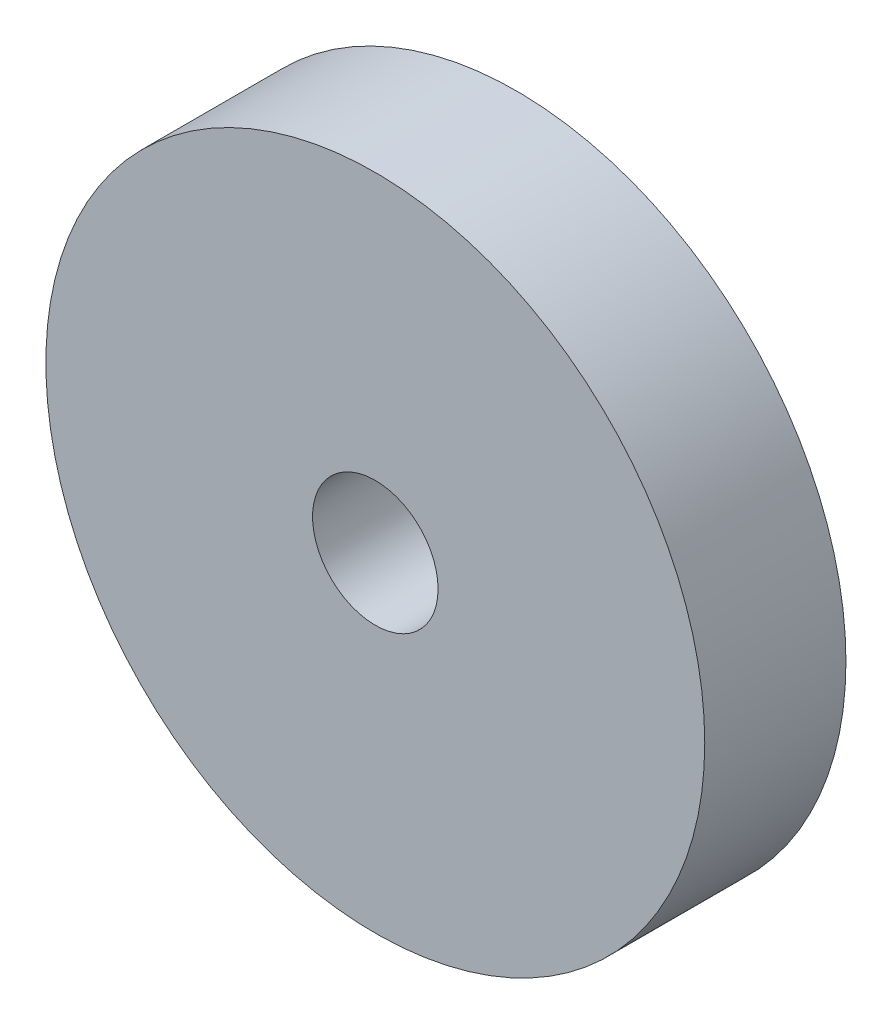
ISO-10303-21;
HEADER;
FILE_DESCRIPTION(('STEP AP214'),'2;1');
FILE_NAME('part.step','',(''),(''),'','','');
FILE_SCHEMA(('AUTOMOTIVE_DESIGN { 1 0 10303 214 1 1 1 1 }'));
ENDSEC;
DATA;
#1=APPLICATION_CONTEXT('core data for automotive mechanical design processes');
#2=APPLICATION_PROTOCOL_DEFINITION('international standard','automotive_design',2000,#1);
#3=PRODUCT_CONTEXT('',#1,'mechanical');
#4=PRODUCT('Part','Part','',(#3));
#5=PRODUCT_RELATED_PRODUCT_CATEGORY('part','',(#4));
#6=PRODUCT_DEFINITION_FORMATION('','',#4);
#7=PRODUCT_DEFINITION_CONTEXT('part definition',#1,'design');
#8=PRODUCT_DEFINITION('design','',#6,#7);
#9=PRODUCT_DEFINITION_SHAPE('','',#8);
#10=(LENGTH_UNIT() NAMED_UNIT(*) SI_UNIT(.MILLI.,.METRE.));
#11=(NAMED_UNIT(*) PLANE_ANGLE_UNIT() SI_UNIT($,.RADIAN.));
#12=(NAMED_UNIT(*) SI_UNIT($,.STERADIAN.) SOLID_ANGLE_UNIT());
#13=UNCERTAINTY_MEASURE_WITH_UNIT(LENGTH_MEASURE(1.E-05),#10,'distance_accuracy_value','');
#14=(GEOMETRIC_REPRESENTATION_CONTEXT(3) GLOBAL_UNCERTAINTY_ASSIGNED_CONTEXT((#13)) GLOBAL_UNIT_ASSIGNED_CONTEXT((#10,
#11,#12)) REPRESENTATION_CONTEXT('',''));
#15=CARTESIAN_POINT('',(0.,0.,0.));
#16=DIRECTION('',(0.,0.,1.));
#17=DIRECTION('',(1.,0.,0.));
#18=AXIS2_PLACEMENT_3D('',#15,#16,#17);
#19=CARTESIAN_POINT('',(0.,0.,18.));
#20=DIRECTION('',(0.,0.,1.));
#21=DIRECTION('',(1.,0.,0.));
#22=AXIS2_PLACEMENT_3D('',#19,#20,#21);
#23=PLANE('',#22);
#24=CARTESIAN_POINT('',(0.,0.,18.));
#25=DIRECTION('',(0.,0.,1.));
#26=DIRECTION('',(1.,0.,0.));
#27=AXIS2_PLACEMENT_3D('',#24,#25,#26);
#28=CIRCLE('',#27,42.);
#29=CARTESIAN_POINT('',(42.,0.,18.));
#30=VERTEX_POINT('',#29);
#31=EDGE_CURVE('E10',#30,#30,#28,.T.);
#32=ORIENTED_EDGE('',*,*,#31,.T.);
#33=EDGE_LOOP('',(#32));
#34=FACE_BOUND('',#33,.T.);
#35=CARTESIAN_POINT('',(0.,0.,18.));
#36=DIRECTION('',(0.,0.,1.));
#37=DIRECTION('',(1.,0.,0.));
#38=AXIS2_PLACEMENT_3D('',#35,#36,#37);
#39=CIRCLE('',#38,8.);
#40=CARTESIAN_POINT('',(8.,0.,18.));
#41=VERTEX_POINT('',#40);
#42=EDGE_CURVE('E48',#41,#41,#39,.T.);
#43=ORIENTED_EDGE('',*,*,#42,.F.);
#44=EDGE_LOOP('',(#43));
#45=FACE_BOUND('',#44,.T.);
#46=ADVANCED_FACE('F37',(#34,#45),#23,.T.);
#47=CARTESIAN_POINT('',(0.,0.,0.));
#48=DIRECTION('',(0.,0.,1.));
#49=DIRECTION('',(1.,0.,0.));
#50=AXIS2_PLACEMENT_3D('',#47,#48,#49);
#51=PLANE('',#50);
#52=CARTESIAN_POINT('',(0.,0.,0.));
#53=DIRECTION('',(0.,0.,1.));
#54=DIRECTION('',(1.,0.,0.));
#55=AXIS2_PLACEMENT_3D('',#52,#53,#54);
#56=CIRCLE('',#55,42.);
#57=CARTESIAN_POINT('',(42.,0.,0.));
#58=VERTEX_POINT('',#57);
#59=EDGE_CURVE('E41',#58,#58,#56,.T.);
#60=ORIENTED_EDGE('',*,*,#59,.F.);
#61=EDGE_LOOP('',(#60));
#62=FACE_BOUND('',#61,.T.);
#63=CARTESIAN_POINT('',(0.,0.,0.));
#64=DIRECTION('',(0.,0.,1.));
#65=DIRECTION('',(1.,0.,0.));
#66=AXIS2_PLACEMENT_3D('',#63,#64,#65);
#67=CIRCLE('',#66,8.);
#68=CARTESIAN_POINT('',(8.,0.,0.));
#69=VERTEX_POINT('',#68);
#70=EDGE_CURVE('E50',#69,#69,#67,.T.);
#71=ORIENTED_EDGE('',*,*,#70,.T.);
#72=EDGE_LOOP('',(#71));
#73=FACE_BOUND('',#72,.T.);
#74=ADVANCED_FACE('F60',(#62,#73),#51,.F.);
#75=CARTESIAN_POINT('',(0.,0.,18.));
#76=DIRECTION('',(0.,0.,-1.));
#77=DIRECTION('',(-1.,0.,0.));
#78=AXIS2_PLACEMENT_3D('',#75,#76,#77);
#79=CYLINDRICAL_SURFACE('',#78,42.);
#80=ORIENTED_EDGE('',*,*,#31,.F.);
#81=EDGE_LOOP('',(#80));
#82=FACE_BOUND('',#81,.T.);
#83=ORIENTED_EDGE('',*,*,#59,.T.);
#84=EDGE_LOOP('',(#83));
#85=FACE_BOUND('',#84,.T.);
#86=ADVANCED_FACE('F39',(#82,#85),#79,.T.);
#87=CARTESIAN_POINT('',(0.,0.,18.));
#88=DIRECTION('',(0.,0.,-1.));
#89=DIRECTION('',(-1.,0.,0.));
#90=AXIS2_PLACEMENT_3D('',#87,#88,#89);
#91=CYLINDRICAL_SURFACE('',#90,8.);
#92=ORIENTED_EDGE('',*,*,#42,.T.);
#93=EDGE_LOOP('',(#92));
#94=FACE_BOUND('',#93,.T.);
#95=ORIENTED_EDGE('',*,*,#70,.F.);
#96=EDGE_LOOP('',(#95));
#97=FACE_BOUND('',#96,.T.);
#98=ADVANCED_FACE('F56',(#94,#97),#91,.F.);
#99=CLOSED_SHELL('',(#46,#74,#86,#98));
#100=MANIFOLD_SOLID_BREP('B2',#99);
#101=ADVANCED_BREP_SHAPE_REPRESENTATION('',(#18,#100),#14);
#102=SHAPE_DEFINITION_REPRESENTATION(#9,#101);
ENDSEC;
END-ISO-10303-21;
